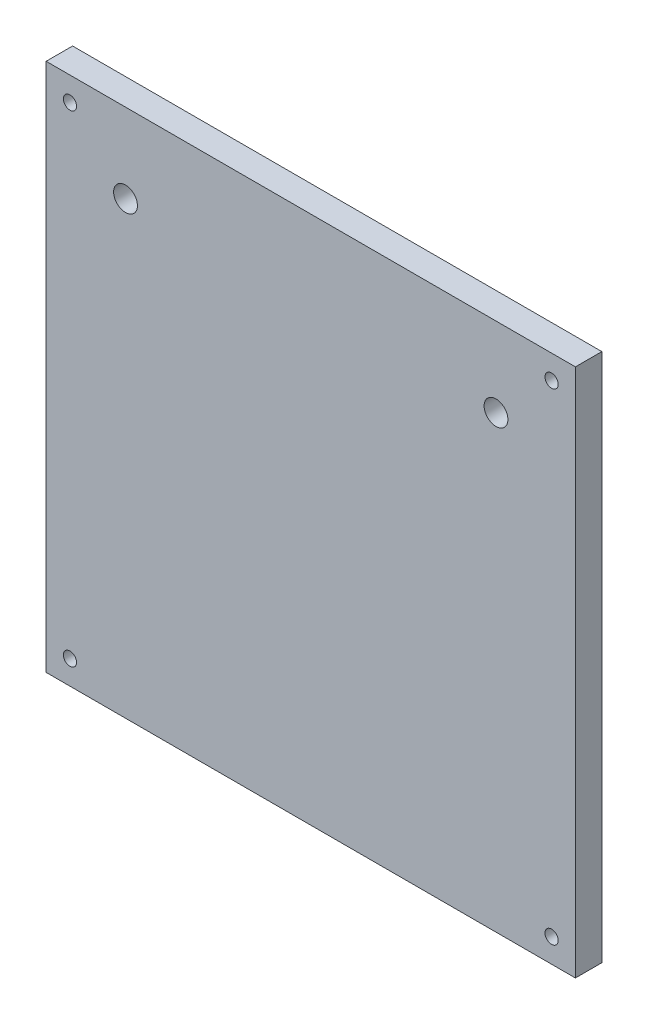
ISO-10303-21;
HEADER;
FILE_DESCRIPTION(('STEP AP214'),'2;1');
FILE_NAME('part.step','',(''),(''),'','','');
FILE_SCHEMA(('AUTOMOTIVE_DESIGN { 1 0 10303 214 1 1 1 1 }'));
ENDSEC;
DATA;
#1=APPLICATION_CONTEXT('core data for automotive mechanical design processes');
#2=APPLICATION_PROTOCOL_DEFINITION('international standard','automotive_design',2000,#1);
#3=PRODUCT_CONTEXT('',#1,'mechanical');
#4=PRODUCT('Part','Part','',(#3));
#5=PRODUCT_RELATED_PRODUCT_CATEGORY('part','',(#4));
#6=PRODUCT_DEFINITION_FORMATION('','',#4);
#7=PRODUCT_DEFINITION_CONTEXT('part definition',#1,'design');
#8=PRODUCT_DEFINITION('design','',#6,#7);
#9=PRODUCT_DEFINITION_SHAPE('','',#8);
#10=(LENGTH_UNIT() NAMED_UNIT(*) SI_UNIT(.MILLI.,.METRE.));
#11=(NAMED_UNIT(*) PLANE_ANGLE_UNIT() SI_UNIT($,.RADIAN.));
#12=(NAMED_UNIT(*) SI_UNIT($,.STERADIAN.) SOLID_ANGLE_UNIT());
#13=UNCERTAINTY_MEASURE_WITH_UNIT(LENGTH_MEASURE(1.E-05),#10,'distance_accuracy_value','');
#14=(GEOMETRIC_REPRESENTATION_CONTEXT(3) GLOBAL_UNCERTAINTY_ASSIGNED_CONTEXT((#13)) GLOBAL_UNIT_ASSIGNED_CONTEXT((#10,
#11,#12)) REPRESENTATION_CONTEXT('',''));
#15=CARTESIAN_POINT('',(0.,0.,0.));
#16=DIRECTION('',(0.,0.,1.));
#17=DIRECTION('',(1.,0.,0.));
#18=AXIS2_PLACEMENT_3D('',#15,#16,#17);
#19=CARTESIAN_POINT('',(0.,0.,5.));
#20=DIRECTION('',(0.,0.,1.));
#21=DIRECTION('',(1.,0.,0.));
#22=AXIS2_PLACEMENT_3D('',#19,#20,#21);
#23=PLANE('',#22);
#24=CARTESIAN_POINT('',(-35.,35.,5.));
#25=DIRECTION('',(0.,0.,1.));
#26=DIRECTION('',(1.,0.,0.));
#27=AXIS2_PLACEMENT_3D('',#24,#25,#26);
#28=CIRCLE('',#27,2.25);
#29=CARTESIAN_POINT('',(-32.75,35.,5.));
#30=VERTEX_POINT('',#29);
#31=EDGE_CURVE('E132',#30,#30,#28,.T.);
#32=ORIENTED_EDGE('',*,*,#31,.F.);
#33=EDGE_LOOP('',(#32));
#34=FACE_BOUND('',#33,.T.);
#35=CARTESIAN_POINT('',(45.5,-45.5,5.));
#36=DIRECTION('',(0.,0.,1.));
#37=DIRECTION('',(1.,0.,0.));
#38=AXIS2_PLACEMENT_3D('',#35,#36,#37);
#39=CIRCLE('',#38,1.25);
#40=CARTESIAN_POINT('',(46.75,-45.5,5.));
#41=VERTEX_POINT('',#40);
#42=EDGE_CURVE('E120',#41,#41,#39,.T.);
#43=ORIENTED_EDGE('',*,*,#42,.F.);
#44=EDGE_LOOP('',(#43));
#45=FACE_BOUND('',#44,.T.);
#46=CARTESIAN_POINT('',(-45.5,45.5,5.));
#47=DIRECTION('',(0.,0.,1.));
#48=DIRECTION('',(1.,0.,0.));
#49=AXIS2_PLACEMENT_3D('',#46,#47,#48);
#50=CIRCLE('',#49,1.25);
#51=CARTESIAN_POINT('',(-44.25,45.5,5.));
#52=VERTEX_POINT('',#51);
#53=EDGE_CURVE('E99',#52,#52,#50,.T.);
#54=ORIENTED_EDGE('',*,*,#53,.F.);
#55=EDGE_LOOP('',(#54));
#56=FACE_BOUND('',#55,.T.);
#57=DIRECTION('',(0.,-1.,0.));
#58=VECTOR('',#57,1.);
#59=CARTESIAN_POINT('',(-50.,-50.,5.));
#60=LINE('',#59,#58);
#61=CARTESIAN_POINT('',(-50.,50.,5.));
#62=VERTEX_POINT('',#61);
#63=CARTESIAN_POINT('',(-50.,-50.,5.));
#64=VERTEX_POINT('',#63);
#65=EDGE_CURVE('E84',#62,#64,#60,.T.);
#66=ORIENTED_EDGE('',*,*,#65,.T.);
#67=DIRECTION('',(1.,0.,0.));
#68=VECTOR('',#67,1.);
#69=CARTESIAN_POINT('',(50.,-50.,5.));
#70=LINE('',#69,#68);
#71=CARTESIAN_POINT('',(50.,-50.,5.));
#72=VERTEX_POINT('',#71);
#73=EDGE_CURVE('E79',#64,#72,#70,.T.);
#74=ORIENTED_EDGE('',*,*,#73,.T.);
#75=DIRECTION('',(0.,1.,0.));
#76=VECTOR('',#75,1.);
#77=CARTESIAN_POINT('',(50.,-50.,5.));
#78=LINE('',#77,#76);
#79=CARTESIAN_POINT('',(50.,50.,5.));
#80=VERTEX_POINT('',#79);
#81=EDGE_CURVE('E82',#72,#80,#78,.T.);
#82=ORIENTED_EDGE('',*,*,#81,.T.);
#83=DIRECTION('',(-1.,0.,0.));
#84=VECTOR('',#83,1.);
#85=CARTESIAN_POINT('',(50.,50.,5.));
#86=LINE('',#85,#84);
#87=EDGE_CURVE('E49',#80,#62,#86,.T.);
#88=ORIENTED_EDGE('',*,*,#87,.T.);
#89=EDGE_LOOP('',(#66,#74,#82,#88));
#90=FACE_BOUND('',#89,.T.);
#91=CARTESIAN_POINT('',(45.5,45.5,5.));
#92=DIRECTION('',(0.,0.,1.));
#93=DIRECTION('',(1.,0.,0.));
#94=AXIS2_PLACEMENT_3D('',#91,#92,#93);
#95=CIRCLE('',#94,1.25);
#96=CARTESIAN_POINT('',(46.75,45.5,5.));
#97=VERTEX_POINT('',#96);
#98=EDGE_CURVE('E114',#97,#97,#95,.T.);
#99=ORIENTED_EDGE('',*,*,#98,.F.);
#100=EDGE_LOOP('',(#99));
#101=FACE_BOUND('',#100,.T.);
#102=CARTESIAN_POINT('',(-45.5,-45.5,5.));
#103=DIRECTION('',(0.,0.,1.));
#104=DIRECTION('',(1.,0.,0.));
#105=AXIS2_PLACEMENT_3D('',#102,#103,#104);
#106=CIRCLE('',#105,1.25);
#107=CARTESIAN_POINT('',(-44.25,-45.5,5.));
#108=VERTEX_POINT('',#107);
#109=EDGE_CURVE('E126',#108,#108,#106,.T.);
#110=ORIENTED_EDGE('',*,*,#109,.F.);
#111=EDGE_LOOP('',(#110));
#112=FACE_BOUND('',#111,.T.);
#113=CARTESIAN_POINT('',(35.,35.,5.));
#114=DIRECTION('',(0.,0.,1.));
#115=DIRECTION('',(1.,0.,0.));
#116=AXIS2_PLACEMENT_3D('',#113,#114,#115);
#117=CIRCLE('',#116,2.25);
#118=CARTESIAN_POINT('',(37.25,35.,5.));
#119=VERTEX_POINT('',#118);
#120=EDGE_CURVE('E138',#119,#119,#117,.T.);
#121=ORIENTED_EDGE('',*,*,#120,.F.);
#122=EDGE_LOOP('',(#121));
#123=FACE_BOUND('',#122,.T.);
#124=ADVANCED_FACE('F32',(#34,#45,#56,#90,#101,#112,#123),#23,.T.);
#125=CARTESIAN_POINT('',(0.,0.,0.));
#126=DIRECTION('',(0.,0.,1.));
#127=DIRECTION('',(1.,0.,0.));
#128=AXIS2_PLACEMENT_3D('',#125,#126,#127);
#129=PLANE('',#128);
#130=DIRECTION('',(0.,-1.,0.));
#131=VECTOR('',#130,1.);
#132=CARTESIAN_POINT('',(-50.,-50.,0.));
#133=LINE('',#132,#131);
#134=CARTESIAN_POINT('',(-50.,50.,0.));
#135=VERTEX_POINT('',#134);
#136=CARTESIAN_POINT('',(-50.,-50.,0.));
#137=VERTEX_POINT('',#136);
#138=EDGE_CURVE('E96',#135,#137,#133,.T.);
#139=ORIENTED_EDGE('',*,*,#138,.F.);
#140=DIRECTION('',(-1.,0.,0.));
#141=VECTOR('',#140,1.);
#142=CARTESIAN_POINT('',(50.,50.,0.));
#143=LINE('',#142,#141);
#144=CARTESIAN_POINT('',(50.,50.,0.));
#145=VERTEX_POINT('',#144);
#146=EDGE_CURVE('E72',#145,#135,#143,.T.);
#147=ORIENTED_EDGE('',*,*,#146,.F.);
#148=DIRECTION('',(0.,1.,0.));
#149=VECTOR('',#148,1.);
#150=CARTESIAN_POINT('',(50.,-50.,0.));
#151=LINE('',#150,#149);
#152=CARTESIAN_POINT('',(50.,-50.,0.));
#153=VERTEX_POINT('',#152);
#154=EDGE_CURVE('E66',#153,#145,#151,.T.);
#155=ORIENTED_EDGE('',*,*,#154,.F.);
#156=DIRECTION('',(1.,0.,0.));
#157=VECTOR('',#156,1.);
#158=CARTESIAN_POINT('',(50.,-50.,0.));
#159=LINE('',#158,#157);
#160=EDGE_CURVE('E88',#137,#153,#159,.T.);
#161=ORIENTED_EDGE('',*,*,#160,.F.);
#162=EDGE_LOOP('',(#139,#147,#155,#161));
#163=FACE_BOUND('',#162,.T.);
#164=CARTESIAN_POINT('',(-45.5,45.5,0.));
#165=DIRECTION('',(0.,0.,1.));
#166=DIRECTION('',(1.,0.,0.));
#167=AXIS2_PLACEMENT_3D('',#164,#165,#166);
#168=CIRCLE('',#167,1.25);
#169=CARTESIAN_POINT('',(-44.25,45.5,0.));
#170=VERTEX_POINT('',#169);
#171=EDGE_CURVE('E111',#170,#170,#168,.T.);
#172=ORIENTED_EDGE('',*,*,#171,.T.);
#173=EDGE_LOOP('',(#172));
#174=FACE_BOUND('',#173,.T.);
#175=CARTESIAN_POINT('',(45.5,45.5,0.));
#176=DIRECTION('',(0.,0.,1.));
#177=DIRECTION('',(1.,0.,0.));
#178=AXIS2_PLACEMENT_3D('',#175,#176,#177);
#179=CIRCLE('',#178,1.25);
#180=CARTESIAN_POINT('',(46.75,45.5,0.));
#181=VERTEX_POINT('',#180);
#182=EDGE_CURVE('E117',#181,#181,#179,.T.);
#183=ORIENTED_EDGE('',*,*,#182,.T.);
#184=EDGE_LOOP('',(#183));
#185=FACE_BOUND('',#184,.T.);
#186=CARTESIAN_POINT('',(45.5,-45.5,0.));
#187=DIRECTION('',(0.,0.,1.));
#188=DIRECTION('',(1.,0.,0.));
#189=AXIS2_PLACEMENT_3D('',#186,#187,#188);
#190=CIRCLE('',#189,1.25);
#191=CARTESIAN_POINT('',(46.75,-45.5,0.));
#192=VERTEX_POINT('',#191);
#193=EDGE_CURVE('E123',#192,#192,#190,.T.);
#194=ORIENTED_EDGE('',*,*,#193,.T.);
#195=EDGE_LOOP('',(#194));
#196=FACE_BOUND('',#195,.T.);
#197=CARTESIAN_POINT('',(-45.5,-45.5,0.));
#198=DIRECTION('',(0.,0.,1.));
#199=DIRECTION('',(1.,0.,0.));
#200=AXIS2_PLACEMENT_3D('',#197,#198,#199);
#201=CIRCLE('',#200,1.25);
#202=CARTESIAN_POINT('',(-44.25,-45.5,0.));
#203=VERTEX_POINT('',#202);
#204=EDGE_CURVE('E129',#203,#203,#201,.T.);
#205=ORIENTED_EDGE('',*,*,#204,.T.);
#206=EDGE_LOOP('',(#205));
#207=FACE_BOUND('',#206,.T.);
#208=CARTESIAN_POINT('',(-35.,35.,0.));
#209=DIRECTION('',(0.,0.,1.));
#210=DIRECTION('',(1.,0.,0.));
#211=AXIS2_PLACEMENT_3D('',#208,#209,#210);
#212=CIRCLE('',#211,2.25);
#213=CARTESIAN_POINT('',(-32.75,35.,0.));
#214=VERTEX_POINT('',#213);
#215=EDGE_CURVE('E135',#214,#214,#212,.T.);
#216=ORIENTED_EDGE('',*,*,#215,.T.);
#217=EDGE_LOOP('',(#216));
#218=FACE_BOUND('',#217,.T.);
#219=CARTESIAN_POINT('',(35.,35.,0.));
#220=DIRECTION('',(0.,0.,1.));
#221=DIRECTION('',(1.,0.,0.));
#222=AXIS2_PLACEMENT_3D('',#219,#220,#221);
#223=CIRCLE('',#222,2.25);
#224=CARTESIAN_POINT('',(37.25,35.,0.));
#225=VERTEX_POINT('',#224);
#226=EDGE_CURVE('E141',#225,#225,#223,.T.);
#227=ORIENTED_EDGE('',*,*,#226,.T.);
#228=EDGE_LOOP('',(#227));
#229=FACE_BOUND('',#228,.T.);
#230=ADVANCED_FACE('F107',(#163,#174,#185,#196,#207,#218,#229),#129,.F.);
#231=CARTESIAN_POINT('',(-50.,-50.,5.));
#232=DIRECTION('',(1.,0.,0.));
#233=DIRECTION('',(0.,0.,-1.));
#234=AXIS2_PLACEMENT_3D('',#231,#232,#233);
#235=PLANE('',#234);
#236=ORIENTED_EDGE('',*,*,#138,.T.);
#237=DIRECTION('',(0.,0.,-1.));
#238=VECTOR('',#237,1.);
#239=CARTESIAN_POINT('',(-50.,-50.,5.));
#240=LINE('',#239,#238);
#241=EDGE_CURVE('E11',#64,#137,#240,.T.);
#242=ORIENTED_EDGE('',*,*,#241,.F.);
#243=ORIENTED_EDGE('',*,*,#65,.F.);
#244=DIRECTION('',(0.,0.,-1.));
#245=VECTOR('',#244,1.);
#246=CARTESIAN_POINT('',(-50.,50.,5.));
#247=LINE('',#246,#245);
#248=EDGE_CURVE('E92',#62,#135,#247,.T.);
#249=ORIENTED_EDGE('',*,*,#248,.T.);
#250=EDGE_LOOP('',(#236,#242,#243,#249));
#251=FACE_BOUND('',#250,.T.);
#252=ADVANCED_FACE('F34',(#251),#235,.F.);
#253=CARTESIAN_POINT('',(50.,-50.,5.));
#254=DIRECTION('',(0.,1.,0.));
#255=DIRECTION('',(-1.,0.,0.));
#256=AXIS2_PLACEMENT_3D('',#253,#254,#255);
#257=PLANE('',#256);
#258=ORIENTED_EDGE('',*,*,#160,.T.);
#259=DIRECTION('',(0.,0.,-1.));
#260=VECTOR('',#259,1.);
#261=CARTESIAN_POINT('',(50.,-50.,5.));
#262=LINE('',#261,#260);
#263=EDGE_CURVE('E41',#72,#153,#262,.T.);
#264=ORIENTED_EDGE('',*,*,#263,.F.);
#265=ORIENTED_EDGE('',*,*,#73,.F.);
#266=ORIENTED_EDGE('',*,*,#241,.T.);
#267=EDGE_LOOP('',(#258,#264,#265,#266));
#268=FACE_BOUND('',#267,.T.);
#269=ADVANCED_FACE('F87',(#268),#257,.F.);
#270=CARTESIAN_POINT('',(50.,-50.,5.));
#271=DIRECTION('',(-1.,0.,0.));
#272=DIRECTION('',(0.,0.,1.));
#273=AXIS2_PLACEMENT_3D('',#270,#271,#272);
#274=PLANE('',#273);
#275=ORIENTED_EDGE('',*,*,#154,.T.);
#276=DIRECTION('',(0.,0.,-1.));
#277=VECTOR('',#276,1.);
#278=CARTESIAN_POINT('',(50.,50.,5.));
#279=LINE('',#278,#277);
#280=EDGE_CURVE('E89',#80,#145,#279,.T.);
#281=ORIENTED_EDGE('',*,*,#280,.F.);
#282=ORIENTED_EDGE('',*,*,#81,.F.);
#283=ORIENTED_EDGE('',*,*,#263,.T.);
#284=EDGE_LOOP('',(#275,#281,#282,#283));
#285=FACE_BOUND('',#284,.T.);
#286=ADVANCED_FACE('F90',(#285),#274,.F.);
#287=CARTESIAN_POINT('',(50.,50.,5.));
#288=DIRECTION('',(0.,-1.,0.));
#289=DIRECTION('',(1.,0.,0.));
#290=AXIS2_PLACEMENT_3D('',#287,#288,#289);
#291=PLANE('',#290);
#292=ORIENTED_EDGE('',*,*,#146,.T.);
#293=ORIENTED_EDGE('',*,*,#248,.F.);
#294=ORIENTED_EDGE('',*,*,#87,.F.);
#295=ORIENTED_EDGE('',*,*,#280,.T.);
#296=EDGE_LOOP('',(#292,#293,#294,#295));
#297=FACE_BOUND('',#296,.T.);
#298=ADVANCED_FACE('F104',(#297),#291,.F.);
#299=CARTESIAN_POINT('',(-45.5,45.5,5.));
#300=DIRECTION('',(0.,0.,-1.));
#301=DIRECTION('',(-1.,0.,0.));
#302=AXIS2_PLACEMENT_3D('',#299,#300,#301);
#303=CYLINDRICAL_SURFACE('',#302,1.25);
#304=ORIENTED_EDGE('',*,*,#53,.T.);
#305=EDGE_LOOP('',(#304));
#306=FACE_BOUND('',#305,.T.);
#307=ORIENTED_EDGE('',*,*,#171,.F.);
#308=EDGE_LOOP('',(#307));
#309=FACE_BOUND('',#308,.T.);
#310=ADVANCED_FACE('F160',(#306,#309),#303,.F.);
#311=CARTESIAN_POINT('',(45.5,45.5,5.));
#312=DIRECTION('',(0.,0.,-1.));
#313=DIRECTION('',(-1.,0.,0.));
#314=AXIS2_PLACEMENT_3D('',#311,#312,#313);
#315=CYLINDRICAL_SURFACE('',#314,1.25);
#316=ORIENTED_EDGE('',*,*,#98,.T.);
#317=EDGE_LOOP('',(#316));
#318=FACE_BOUND('',#317,.T.);
#319=ORIENTED_EDGE('',*,*,#182,.F.);
#320=EDGE_LOOP('',(#319));
#321=FACE_BOUND('',#320,.T.);
#322=ADVANCED_FACE('F206',(#318,#321),#315,.F.);
#323=CARTESIAN_POINT('',(45.5,-45.5,5.));
#324=DIRECTION('',(0.,0.,-1.));
#325=DIRECTION('',(-1.,0.,0.));
#326=AXIS2_PLACEMENT_3D('',#323,#324,#325);
#327=CYLINDRICAL_SURFACE('',#326,1.25);
#328=ORIENTED_EDGE('',*,*,#42,.T.);
#329=EDGE_LOOP('',(#328));
#330=FACE_BOUND('',#329,.T.);
#331=ORIENTED_EDGE('',*,*,#193,.F.);
#332=EDGE_LOOP('',(#331));
#333=FACE_BOUND('',#332,.T.);
#334=ADVANCED_FACE('F214',(#330,#333),#327,.F.);
#335=CARTESIAN_POINT('',(-45.5,-45.5,5.));
#336=DIRECTION('',(0.,0.,-1.));
#337=DIRECTION('',(-1.,0.,0.));
#338=AXIS2_PLACEMENT_3D('',#335,#336,#337);
#339=CYLINDRICAL_SURFACE('',#338,1.25);
#340=ORIENTED_EDGE('',*,*,#109,.T.);
#341=EDGE_LOOP('',(#340));
#342=FACE_BOUND('',#341,.T.);
#343=ORIENTED_EDGE('',*,*,#204,.F.);
#344=EDGE_LOOP('',(#343));
#345=FACE_BOUND('',#344,.T.);
#346=ADVANCED_FACE('F222',(#342,#345),#339,.F.);
#347=CARTESIAN_POINT('',(-35.,35.,5.));
#348=DIRECTION('',(0.,0.,-1.));
#349=DIRECTION('',(-1.,0.,0.));
#350=AXIS2_PLACEMENT_3D('',#347,#348,#349);
#351=CYLINDRICAL_SURFACE('',#350,2.25);
#352=ORIENTED_EDGE('',*,*,#31,.T.);
#353=EDGE_LOOP('',(#352));
#354=FACE_BOUND('',#353,.T.);
#355=ORIENTED_EDGE('',*,*,#215,.F.);
#356=EDGE_LOOP('',(#355));
#357=FACE_BOUND('',#356,.T.);
#358=ADVANCED_FACE('F231',(#354,#357),#351,.F.);
#359=CARTESIAN_POINT('',(35.,35.,5.));
#360=DIRECTION('',(0.,0.,-1.));
#361=DIRECTION('',(-1.,0.,0.));
#362=AXIS2_PLACEMENT_3D('',#359,#360,#361);
#363=CYLINDRICAL_SURFACE('',#362,2.25);
#364=ORIENTED_EDGE('',*,*,#120,.T.);
#365=EDGE_LOOP('',(#364));
#366=FACE_BOUND('',#365,.T.);
#367=ORIENTED_EDGE('',*,*,#226,.F.);
#368=EDGE_LOOP('',(#367));
#369=FACE_BOUND('',#368,.T.);
#370=ADVANCED_FACE('F147',(#366,#369),#363,.F.);
#371=CLOSED_SHELL('',(#124,#230,#252,#269,#286,#298,#310,#322,#334,#346,#358,#370));
#372=MANIFOLD_SOLID_BREP('B2',#371);
#373=ADVANCED_BREP_SHAPE_REPRESENTATION('',(#18,#372),#14);
#374=SHAPE_DEFINITION_REPRESENTATION(#9,#373);
ENDSEC;
END-ISO-10303-21;
